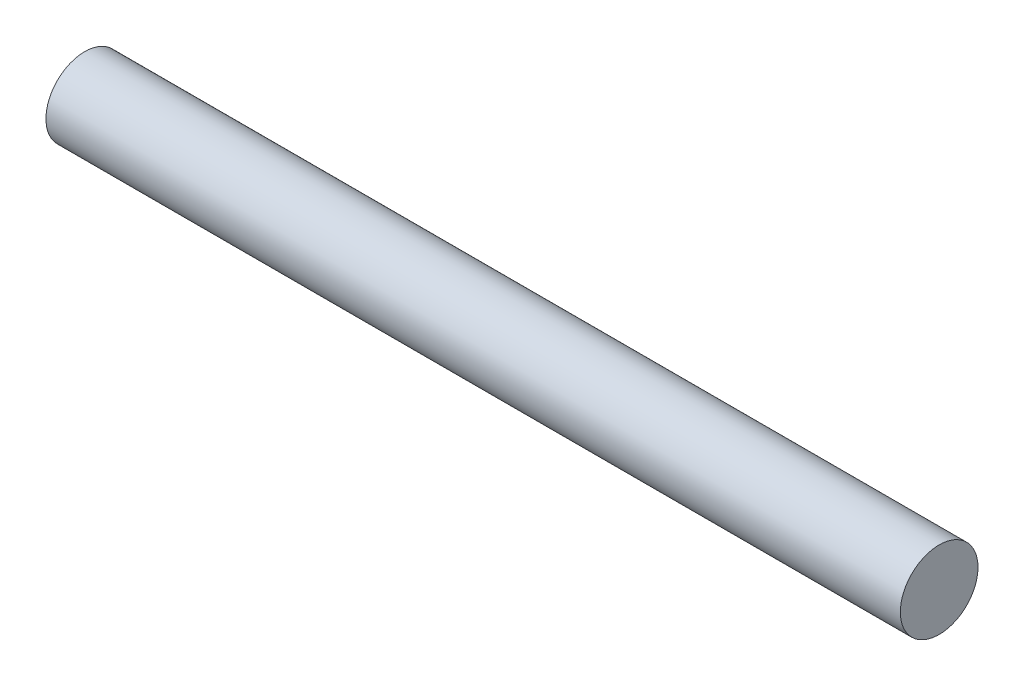
ISO-10303-21;
HEADER;
FILE_DESCRIPTION(('STEP AP214'),'2;1');
FILE_NAME('part.step','',(''),(''),'','','');
FILE_SCHEMA(('AUTOMOTIVE_DESIGN { 1 0 10303 214 1 1 1 1 }'));
ENDSEC;
DATA;
#1=APPLICATION_CONTEXT('core data for automotive mechanical design processes');
#2=APPLICATION_PROTOCOL_DEFINITION('international standard','automotive_design',2000,#1);
#3=PRODUCT_CONTEXT('',#1,'mechanical');
#4=PRODUCT('Part','Part','',(#3));
#5=PRODUCT_RELATED_PRODUCT_CATEGORY('part','',(#4));
#6=PRODUCT_DEFINITION_FORMATION('','',#4);
#7=PRODUCT_DEFINITION_CONTEXT('part definition',#1,'design');
#8=PRODUCT_DEFINITION('design','',#6,#7);
#9=PRODUCT_DEFINITION_SHAPE('','',#8);
#10=(LENGTH_UNIT() NAMED_UNIT(*) SI_UNIT(.MILLI.,.METRE.));
#11=(NAMED_UNIT(*) PLANE_ANGLE_UNIT() SI_UNIT($,.RADIAN.));
#12=(NAMED_UNIT(*) SI_UNIT($,.STERADIAN.) SOLID_ANGLE_UNIT());
#13=UNCERTAINTY_MEASURE_WITH_UNIT(LENGTH_MEASURE(1.E-05),#10,'distance_accuracy_value','');
#14=(GEOMETRIC_REPRESENTATION_CONTEXT(3) GLOBAL_UNCERTAINTY_ASSIGNED_CONTEXT((#13)) GLOBAL_UNIT_ASSIGNED_CONTEXT((#10,
#11,#12)) REPRESENTATION_CONTEXT('',''));
#15=CARTESIAN_POINT('',(0.,0.,0.));
#16=DIRECTION('',(0.,0.,1.));
#17=DIRECTION('',(1.,0.,0.));
#18=AXIS2_PLACEMENT_3D('',#15,#16,#17);
#19=CARTESIAN_POINT('',(44.,0.,0.));
#20=DIRECTION('',(-1.,0.,0.));
#21=DIRECTION('',(0.,0.,1.));
#22=AXIS2_PLACEMENT_3D('',#19,#20,#21);
#23=CYLINDRICAL_SURFACE('',#22,4.);
#24=CARTESIAN_POINT('',(44.,0.,0.));
#25=DIRECTION('',(1.,0.,0.));
#26=DIRECTION('',(0.,0.,-1.));
#27=AXIS2_PLACEMENT_3D('',#24,#25,#26);
#28=CIRCLE('',#27,4.);
#29=CARTESIAN_POINT('',(44.,0.,-4.));
#30=VERTEX_POINT('',#29);
#31=EDGE_CURVE('E10',#30,#30,#28,.T.);
#32=ORIENTED_EDGE('',*,*,#31,.F.);
#33=EDGE_LOOP('',(#32));
#34=FACE_BOUND('',#33,.T.);
#35=CARTESIAN_POINT('',(-44.,0.,0.));
#36=DIRECTION('',(1.,0.,0.));
#37=DIRECTION('',(0.,0.,-1.));
#38=AXIS2_PLACEMENT_3D('',#35,#36,#37);
#39=CIRCLE('',#38,4.);
#40=CARTESIAN_POINT('',(-44.,0.,-4.));
#41=VERTEX_POINT('',#40);
#42=EDGE_CURVE('E33',#41,#41,#39,.T.);
#43=ORIENTED_EDGE('',*,*,#42,.T.);
#44=EDGE_LOOP('',(#43));
#45=FACE_BOUND('',#44,.T.);
#46=ADVANCED_FACE('F30',(#34,#45),#23,.T.);
#47=CARTESIAN_POINT('',(44.,0.,0.));
#48=DIRECTION('',(1.,0.,0.));
#49=DIRECTION('',(0.,0.,-1.));
#50=AXIS2_PLACEMENT_3D('',#47,#48,#49);
#51=PLANE('',#50);
#52=ORIENTED_EDGE('',*,*,#31,.T.);
#53=EDGE_LOOP('',(#52));
#54=FACE_BOUND('',#53,.T.);
#55=ADVANCED_FACE('F45',(#54),#51,.T.);
#56=CARTESIAN_POINT('',(-44.,0.,0.));
#57=DIRECTION('',(1.,0.,0.));
#58=DIRECTION('',(0.,0.,-1.));
#59=AXIS2_PLACEMENT_3D('',#56,#57,#58);
#60=PLANE('',#59);
#61=ORIENTED_EDGE('',*,*,#42,.F.);
#62=EDGE_LOOP('',(#61));
#63=FACE_BOUND('',#62,.T.);
#64=ADVANCED_FACE('F43',(#63),#60,.F.);
#65=CLOSED_SHELL('',(#46,#55,#64));
#66=MANIFOLD_SOLID_BREP('B2',#65);
#67=ADVANCED_BREP_SHAPE_REPRESENTATION('',(#18,#66),#14);
#68=SHAPE_DEFINITION_REPRESENTATION(#9,#67);
ENDSEC;
END-ISO-10303-21;
